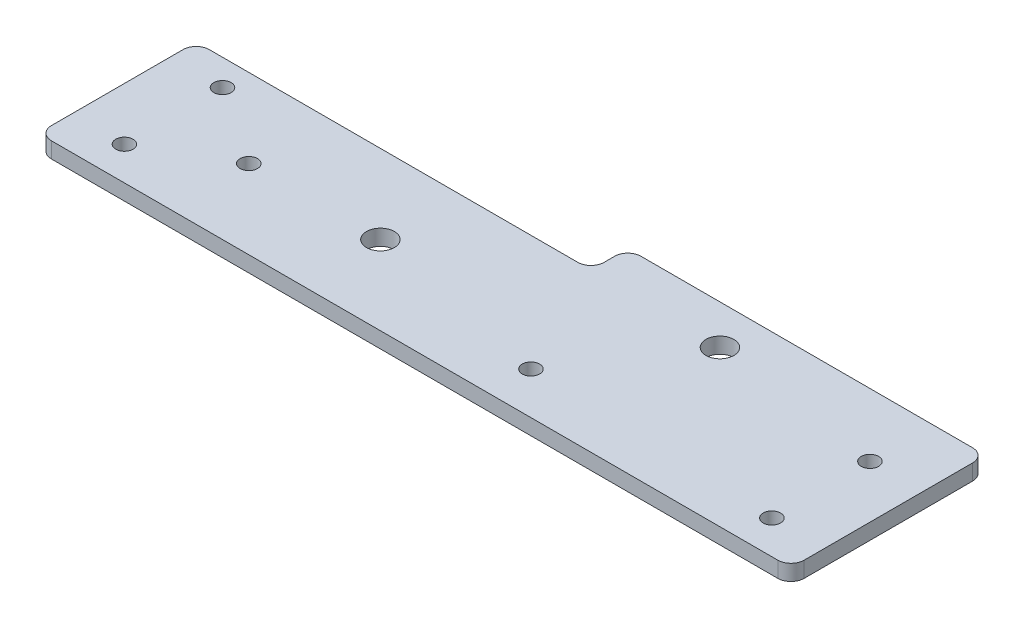
ISO-10303-21;
HEADER;
FILE_DESCRIPTION(('STEP AP214'),'2;1');
FILE_NAME('part.step','',(''),(''),'','','');
FILE_SCHEMA(('AUTOMOTIVE_DESIGN { 1 0 10303 214 1 1 1 1 }'));
ENDSEC;
DATA;
#1=APPLICATION_CONTEXT('core data for automotive mechanical design processes');
#2=APPLICATION_PROTOCOL_DEFINITION('international standard','automotive_design',2000,#1);
#3=PRODUCT_CONTEXT('',#1,'mechanical');
#4=PRODUCT('Part','Part','',(#3));
#5=PRODUCT_RELATED_PRODUCT_CATEGORY('part','',(#4));
#6=PRODUCT_DEFINITION_FORMATION('','',#4);
#7=PRODUCT_DEFINITION_CONTEXT('part definition',#1,'design');
#8=PRODUCT_DEFINITION('design','',#6,#7);
#9=PRODUCT_DEFINITION_SHAPE('','',#8);
#10=(LENGTH_UNIT() NAMED_UNIT(*) SI_UNIT(.MILLI.,.METRE.));
#11=(NAMED_UNIT(*) PLANE_ANGLE_UNIT() SI_UNIT($,.RADIAN.));
#12=(NAMED_UNIT(*) SI_UNIT($,.STERADIAN.) SOLID_ANGLE_UNIT());
#13=UNCERTAINTY_MEASURE_WITH_UNIT(LENGTH_MEASURE(1.E-05),#10,'distance_accuracy_value','');
#14=(GEOMETRIC_REPRESENTATION_CONTEXT(3) GLOBAL_UNCERTAINTY_ASSIGNED_CONTEXT((#13)) GLOBAL_UNIT_ASSIGNED_CONTEXT((#10,
#11,#12)) REPRESENTATION_CONTEXT('',''));
#15=CARTESIAN_POINT('',(0.,0.,0.));
#16=DIRECTION('',(0.,0.,1.));
#17=DIRECTION('',(1.,0.,0.));
#18=AXIS2_PLACEMENT_3D('',#15,#16,#17);
#19=CARTESIAN_POINT('',(0.,3.,0.));
#20=DIRECTION('',(0.,1.,0.));
#21=DIRECTION('',(0.,0.,1.));
#22=AXIS2_PLACEMENT_3D('',#19,#20,#21);
#23=PLANE('',#22);
#24=CARTESIAN_POINT('',(100.,3.,-29.5));
#25=DIRECTION('',(0.,1.,0.));
#26=DIRECTION('',(0.,0.,1.));
#27=AXIS2_PLACEMENT_3D('',#24,#25,#26);
#28=CIRCLE('',#27,2.65);
#29=CARTESIAN_POINT('',(100.,3.,-26.85));
#30=VERTEX_POINT('',#29);
#31=EDGE_CURVE('E263',#30,#30,#28,.T.);
#32=ORIENTED_EDGE('',*,*,#31,.F.);
#33=EDGE_LOOP('',(#32));
#34=FACE_BOUND('',#33,.T.);
#35=CARTESIAN_POINT('',(50.,3.,-15.));
#36=DIRECTION('',(0.,1.,0.));
#37=DIRECTION('',(0.,0.,1.));
#38=AXIS2_PLACEMENT_3D('',#35,#36,#37);
#39=CIRCLE('',#38,2.65);
#40=CARTESIAN_POINT('',(50.,3.,-12.35));
#41=VERTEX_POINT('',#40);
#42=EDGE_CURVE('E251',#41,#41,#39,.T.);
#43=ORIENTED_EDGE('',*,*,#42,.F.);
#44=EDGE_LOOP('',(#43));
#45=FACE_BOUND('',#44,.T.);
#46=CARTESIAN_POINT('',(133.,3.,-25.));
#47=DIRECTION('',(0.,1.,0.));
#48=DIRECTION('',(0.,0.,1.));
#49=AXIS2_PLACEMENT_3D('',#46,#47,#48);
#50=CIRCLE('',#49,1.65000000000002);
#51=CARTESIAN_POINT('',(133.,3.,-23.35));
#52=VERTEX_POINT('',#51);
#53=EDGE_CURVE('E239',#52,#52,#50,.T.);
#54=ORIENTED_EDGE('',*,*,#53,.F.);
#55=EDGE_LOOP('',(#54));
#56=FACE_BOUND('',#55,.T.);
#57=CARTESIAN_POINT('',(9.99999999999999,3.,-25.));
#58=DIRECTION('',(0.,1.,0.));
#59=DIRECTION('',(0.,0.,1.));
#60=AXIS2_PLACEMENT_3D('',#57,#58,#59);
#61=CIRCLE('',#60,1.65);
#62=CARTESIAN_POINT('',(9.99999999999999,3.,-23.35));
#63=VERTEX_POINT('',#62);
#64=EDGE_CURVE('E156',#63,#63,#61,.T.);
#65=ORIENTED_EDGE('',*,*,#64,.F.);
#66=EDGE_LOOP('',(#65));
#67=FACE_BOUND('',#66,.T.);
#68=DIRECTION('',(0.,0.,1.));
#69=VECTOR('',#68,1.);
#70=CARTESIAN_POINT('',(0.,3.,-30.));
#71=LINE('',#70,#69);
#72=CARTESIAN_POINT('',(0.,3.,-27.5));
#73=VERTEX_POINT('',#72);
#74=CARTESIAN_POINT('',(0.,3.,-2.5));
#75=VERTEX_POINT('',#74);
#76=EDGE_CURVE('E167',#73,#75,#71,.T.);
#77=ORIENTED_EDGE('',*,*,#76,.T.);
#78=CARTESIAN_POINT('',(2.5,3.,-2.5));
#79=DIRECTION('',(0.,1.,0.));
#80=DIRECTION('',(0.,0.,1.));
#81=AXIS2_PLACEMENT_3D('',#78,#79,#80);
#82=CIRCLE('',#81,2.5);
#83=CARTESIAN_POINT('',(2.5,3.,0.));
#84=VERTEX_POINT('',#83);
#85=EDGE_CURVE('E187',#75,#84,#82,.T.);
#86=ORIENTED_EDGE('',*,*,#85,.T.);
#87=DIRECTION('',(1.,0.,0.));
#88=VECTOR('',#87,1.);
#89=CARTESIAN_POINT('',(0.,3.,0.));
#90=LINE('',#89,#88);
#91=CARTESIAN_POINT('',(140.5,3.,0.));
#92=VERTEX_POINT('',#91);
#93=EDGE_CURVE('E143',#84,#92,#90,.T.);
#94=ORIENTED_EDGE('',*,*,#93,.T.);
#95=CARTESIAN_POINT('',(140.5,3.,-2.5));
#96=DIRECTION('',(0.,1.,0.));
#97=DIRECTION('',(0.,0.,1.));
#98=AXIS2_PLACEMENT_3D('',#95,#96,#97);
#99=CIRCLE('',#98,2.5);
#100=CARTESIAN_POINT('',(143.,3.,-2.5));
#101=VERTEX_POINT('',#100);
#102=EDGE_CURVE('E185',#92,#101,#99,.T.);
#103=ORIENTED_EDGE('',*,*,#102,.T.);
#104=DIRECTION('',(0.,0.,-1.));
#105=VECTOR('',#104,1.);
#106=CARTESIAN_POINT('',(143.,3.,0.));
#107=LINE('',#106,#105);
#108=CARTESIAN_POINT('',(143.,3.,-34.5));
#109=VERTEX_POINT('',#108);
#110=EDGE_CURVE('E224',#101,#109,#107,.T.);
#111=ORIENTED_EDGE('',*,*,#110,.T.);
#112=CARTESIAN_POINT('',(140.5,3.,-34.5));
#113=DIRECTION('',(0.,1.,0.));
#114=DIRECTION('',(0.,0.,1.));
#115=AXIS2_PLACEMENT_3D('',#112,#113,#114);
#116=CIRCLE('',#115,2.5);
#117=CARTESIAN_POINT('',(140.5,3.,-37.));
#118=VERTEX_POINT('',#117);
#119=EDGE_CURVE('E183',#109,#118,#116,.T.);
#120=ORIENTED_EDGE('',*,*,#119,.T.);
#121=DIRECTION('',(-1.,0.,0.));
#122=VECTOR('',#121,1.);
#123=CARTESIAN_POINT('',(143.,3.,-37.));
#124=LINE('',#123,#122);
#125=CARTESIAN_POINT('',(77.5,3.,-37.));
#126=VERTEX_POINT('',#125);
#127=EDGE_CURVE('E219',#118,#126,#124,.T.);
#128=ORIENTED_EDGE('',*,*,#127,.T.);
#129=CARTESIAN_POINT('',(77.5,3.,-34.5));
#130=DIRECTION('',(0.,1.,0.));
#131=DIRECTION('',(0.,0.,1.));
#132=AXIS2_PLACEMENT_3D('',#129,#130,#131);
#133=CIRCLE('',#132,2.5);
#134=CARTESIAN_POINT('',(75.,3.,-34.5));
#135=VERTEX_POINT('',#134);
#136=EDGE_CURVE('E179',#126,#135,#133,.T.);
#137=ORIENTED_EDGE('',*,*,#136,.T.);
#138=DIRECTION('',(0.,0.,1.));
#139=VECTOR('',#138,1.);
#140=CARTESIAN_POINT('',(75.,3.,-37.));
#141=LINE('',#140,#139);
#142=CARTESIAN_POINT('',(75.,3.,-32.5));
#143=VERTEX_POINT('',#142);
#144=EDGE_CURVE('E218',#135,#143,#141,.T.);
#145=ORIENTED_EDGE('',*,*,#144,.T.);
#146=CARTESIAN_POINT('',(72.5,3.,-32.5));
#147=DIRECTION('',(0.,1.,0.));
#148=DIRECTION('',(0.,0.,1.));
#149=AXIS2_PLACEMENT_3D('',#146,#147,#148);
#150=CIRCLE('',#149,2.5);
#151=CARTESIAN_POINT('',(72.5,3.,-30.));
#152=VERTEX_POINT('',#151);
#153=EDGE_CURVE('E11',#143,#152,#150,.F.);
#154=ORIENTED_EDGE('',*,*,#153,.T.);
#155=DIRECTION('',(-1.,0.,0.));
#156=VECTOR('',#155,1.);
#157=CARTESIAN_POINT('',(75.,3.,-30.));
#158=LINE('',#157,#156);
#159=CARTESIAN_POINT('',(2.5,3.,-30.));
#160=VERTEX_POINT('',#159);
#161=EDGE_CURVE('E168',#152,#160,#158,.T.);
#162=ORIENTED_EDGE('',*,*,#161,.T.);
#163=CARTESIAN_POINT('',(2.5,3.,-27.5));
#164=DIRECTION('',(0.,1.,0.));
#165=DIRECTION('',(0.,0.,1.));
#166=AXIS2_PLACEMENT_3D('',#163,#164,#165);
#167=CIRCLE('',#166,2.5);
#168=EDGE_CURVE('E181',#160,#73,#167,.T.);
#169=ORIENTED_EDGE('',*,*,#168,.T.);
#170=EDGE_LOOP('',(#77,#86,#94,#103,#111,#120,#128,#137,#145,#154,#162,#169));
#171=FACE_BOUND('',#170,.T.);
#172=CARTESIAN_POINT('',(10.,3.,-6.37));
#173=DIRECTION('',(0.,1.,0.));
#174=DIRECTION('',(0.,0.,1.));
#175=AXIS2_PLACEMENT_3D('',#172,#173,#174);
#176=CIRCLE('',#175,1.65);
#177=CARTESIAN_POINT('',(10.,3.,-4.72));
#178=VERTEX_POINT('',#177);
#179=EDGE_CURVE('E233',#178,#178,#176,.T.);
#180=ORIENTED_EDGE('',*,*,#179,.F.);
#181=EDGE_LOOP('',(#180));
#182=FACE_BOUND('',#181,.T.);
#183=CARTESIAN_POINT('',(133.,3.,-6.37000000000001));
#184=DIRECTION('',(0.,1.,0.));
#185=DIRECTION('',(0.,0.,1.));
#186=AXIS2_PLACEMENT_3D('',#183,#184,#185);
#187=CIRCLE('',#186,1.65000000000002);
#188=CARTESIAN_POINT('',(133.,3.,-4.71999999999999));
#189=VERTEX_POINT('',#188);
#190=EDGE_CURVE('E245',#189,#189,#187,.T.);
#191=ORIENTED_EDGE('',*,*,#190,.F.);
#192=EDGE_LOOP('',(#191));
#193=FACE_BOUND('',#192,.T.);
#194=CARTESIAN_POINT('',(25.,3.,-15.));
#195=DIRECTION('',(0.,1.,0.));
#196=DIRECTION('',(0.,0.,1.));
#197=AXIS2_PLACEMENT_3D('',#194,#195,#196);
#198=CIRCLE('',#197,1.65);
#199=CARTESIAN_POINT('',(25.,3.,-13.35));
#200=VERTEX_POINT('',#199);
#201=EDGE_CURVE('E257',#200,#200,#198,.T.);
#202=ORIENTED_EDGE('',*,*,#201,.F.);
#203=EDGE_LOOP('',(#202));
#204=FACE_BOUND('',#203,.T.);
#205=CARTESIAN_POINT('',(85.6,3.,-8.00000000000002));
#206=DIRECTION('',(0.,1.,0.));
#207=DIRECTION('',(0.,0.,1.));
#208=AXIS2_PLACEMENT_3D('',#205,#206,#207);
#209=CIRCLE('',#208,1.65);
#210=CARTESIAN_POINT('',(85.6,3.,-6.35000000000002));
#211=VERTEX_POINT('',#210);
#212=EDGE_CURVE('E269',#211,#211,#209,.T.);
#213=ORIENTED_EDGE('',*,*,#212,.F.);
#214=EDGE_LOOP('',(#213));
#215=FACE_BOUND('',#214,.T.);
#216=ADVANCED_FACE('F34',(#34,#45,#56,#67,#171,#182,#193,#204,#215),#23,.T.);
#217=CARTESIAN_POINT('',(0.,0.,0.));
#218=DIRECTION('',(0.,1.,0.));
#219=DIRECTION('',(0.,0.,1.));
#220=AXIS2_PLACEMENT_3D('',#217,#218,#219);
#221=PLANE('',#220);
#222=DIRECTION('',(1.,0.,0.));
#223=VECTOR('',#222,1.);
#224=CARTESIAN_POINT('',(0.,0.,0.));
#225=LINE('',#224,#223);
#226=CARTESIAN_POINT('',(2.5,0.,0.));
#227=VERTEX_POINT('',#226);
#228=CARTESIAN_POINT('',(140.5,0.,0.));
#229=VERTEX_POINT('',#228);
#230=EDGE_CURVE('E140',#227,#229,#225,.T.);
#231=ORIENTED_EDGE('',*,*,#230,.F.);
#232=CARTESIAN_POINT('',(2.5,0.,-2.5));
#233=DIRECTION('',(0.,1.,0.));
#234=DIRECTION('',(0.,0.,1.));
#235=AXIS2_PLACEMENT_3D('',#232,#233,#234);
#236=CIRCLE('',#235,2.5);
#237=CARTESIAN_POINT('',(0.,0.,-2.5));
#238=VERTEX_POINT('',#237);
#239=EDGE_CURVE('E123',#227,#238,#236,.F.);
#240=ORIENTED_EDGE('',*,*,#239,.T.);
#241=DIRECTION('',(0.,0.,1.));
#242=VECTOR('',#241,1.);
#243=CARTESIAN_POINT('',(0.,0.,-30.));
#244=LINE('',#243,#242);
#245=CARTESIAN_POINT('',(0.,0.,-27.5));
#246=VERTEX_POINT('',#245);
#247=EDGE_CURVE('E151',#246,#238,#244,.T.);
#248=ORIENTED_EDGE('',*,*,#247,.F.);
#249=CARTESIAN_POINT('',(2.5,0.,-27.5));
#250=DIRECTION('',(0.,1.,0.));
#251=DIRECTION('',(0.,0.,1.));
#252=AXIS2_PLACEMENT_3D('',#249,#250,#251);
#253=CIRCLE('',#252,2.5);
#254=CARTESIAN_POINT('',(2.5,0.,-30.));
#255=VERTEX_POINT('',#254);
#256=EDGE_CURVE('E171',#246,#255,#253,.F.);
#257=ORIENTED_EDGE('',*,*,#256,.T.);
#258=DIRECTION('',(-1.,0.,0.));
#259=VECTOR('',#258,1.);
#260=CARTESIAN_POINT('',(75.,0.,-30.));
#261=LINE('',#260,#259);
#262=CARTESIAN_POINT('',(72.5,0.,-30.));
#263=VERTEX_POINT('',#262);
#264=EDGE_CURVE('E165',#263,#255,#261,.T.);
#265=ORIENTED_EDGE('',*,*,#264,.F.);
#266=CARTESIAN_POINT('',(72.5,0.,-32.5));
#267=DIRECTION('',(0.,1.,0.));
#268=DIRECTION('',(0.,0.,1.));
#269=AXIS2_PLACEMENT_3D('',#266,#267,#268);
#270=CIRCLE('',#269,2.5);
#271=CARTESIAN_POINT('',(75.,0.,-32.5));
#272=VERTEX_POINT('',#271);
#273=EDGE_CURVE('E42',#263,#272,#270,.T.);
#274=ORIENTED_EDGE('',*,*,#273,.T.);
#275=DIRECTION('',(0.,0.,1.));
#276=VECTOR('',#275,1.);
#277=CARTESIAN_POINT('',(75.,0.,-37.));
#278=LINE('',#277,#276);
#279=CARTESIAN_POINT('',(75.,0.,-34.5));
#280=VERTEX_POINT('',#279);
#281=EDGE_CURVE('E162',#280,#272,#278,.T.);
#282=ORIENTED_EDGE('',*,*,#281,.F.);
#283=CARTESIAN_POINT('',(77.5,0.,-34.5));
#284=DIRECTION('',(0.,1.,0.));
#285=DIRECTION('',(0.,0.,1.));
#286=AXIS2_PLACEMENT_3D('',#283,#284,#285);
#287=CIRCLE('',#286,2.5);
#288=CARTESIAN_POINT('',(77.5,0.,-37.));
#289=VERTEX_POINT('',#288);
#290=EDGE_CURVE('E144',#280,#289,#287,.F.);
#291=ORIENTED_EDGE('',*,*,#290,.T.);
#292=DIRECTION('',(-1.,0.,0.));
#293=VECTOR('',#292,1.);
#294=CARTESIAN_POINT('',(143.,0.,-37.));
#295=LINE('',#294,#293);
#296=CARTESIAN_POINT('',(140.5,0.,-37.));
#297=VERTEX_POINT('',#296);
#298=EDGE_CURVE('E154',#297,#289,#295,.T.);
#299=ORIENTED_EDGE('',*,*,#298,.F.);
#300=CARTESIAN_POINT('',(140.5,0.,-34.5));
#301=DIRECTION('',(0.,1.,0.));
#302=DIRECTION('',(0.,0.,1.));
#303=AXIS2_PLACEMENT_3D('',#300,#301,#302);
#304=CIRCLE('',#303,2.5);
#305=CARTESIAN_POINT('',(143.,0.,-34.5));
#306=VERTEX_POINT('',#305);
#307=EDGE_CURVE('E173',#297,#306,#304,.F.);
#308=ORIENTED_EDGE('',*,*,#307,.T.);
#309=DIRECTION('',(0.,0.,-1.));
#310=VECTOR('',#309,1.);
#311=CARTESIAN_POINT('',(143.,0.,0.));
#312=LINE('',#311,#310);
#313=CARTESIAN_POINT('',(143.,0.,-2.5));
#314=VERTEX_POINT('',#313);
#315=EDGE_CURVE('E150',#314,#306,#312,.T.);
#316=ORIENTED_EDGE('',*,*,#315,.F.);
#317=CARTESIAN_POINT('',(140.5,0.,-2.5));
#318=DIRECTION('',(0.,1.,0.));
#319=DIRECTION('',(0.,0.,1.));
#320=AXIS2_PLACEMENT_3D('',#317,#318,#319);
#321=CIRCLE('',#320,2.5);
#322=EDGE_CURVE('E134',#314,#229,#321,.F.);
#323=ORIENTED_EDGE('',*,*,#322,.T.);
#324=EDGE_LOOP('',(#231,#240,#248,#257,#265,#274,#282,#291,#299,#308,#316,#323));
#325=FACE_BOUND('',#324,.T.);
#326=CARTESIAN_POINT('',(9.99999999999999,0.,-25.));
#327=DIRECTION('',(0.,1.,0.));
#328=DIRECTION('',(0.,0.,1.));
#329=AXIS2_PLACEMENT_3D('',#326,#327,#328);
#330=CIRCLE('',#329,1.65);
#331=CARTESIAN_POINT('',(9.99999999999999,0.,-23.35));
#332=VERTEX_POINT('',#331);
#333=EDGE_CURVE('E230',#332,#332,#330,.T.);
#334=ORIENTED_EDGE('',*,*,#333,.T.);
#335=EDGE_LOOP('',(#334));
#336=FACE_BOUND('',#335,.T.);
#337=CARTESIAN_POINT('',(10.,0.,-6.37));
#338=DIRECTION('',(0.,1.,0.));
#339=DIRECTION('',(0.,0.,1.));
#340=AXIS2_PLACEMENT_3D('',#337,#338,#339);
#341=CIRCLE('',#340,1.65);
#342=CARTESIAN_POINT('',(10.,0.,-4.72));
#343=VERTEX_POINT('',#342);
#344=EDGE_CURVE('E236',#343,#343,#341,.T.);
#345=ORIENTED_EDGE('',*,*,#344,.T.);
#346=EDGE_LOOP('',(#345));
#347=FACE_BOUND('',#346,.T.);
#348=CARTESIAN_POINT('',(133.,0.,-25.));
#349=DIRECTION('',(0.,1.,0.));
#350=DIRECTION('',(0.,0.,1.));
#351=AXIS2_PLACEMENT_3D('',#348,#349,#350);
#352=CIRCLE('',#351,1.65000000000002);
#353=CARTESIAN_POINT('',(133.,0.,-23.35));
#354=VERTEX_POINT('',#353);
#355=EDGE_CURVE('E242',#354,#354,#352,.T.);
#356=ORIENTED_EDGE('',*,*,#355,.T.);
#357=EDGE_LOOP('',(#356));
#358=FACE_BOUND('',#357,.T.);
#359=CARTESIAN_POINT('',(133.,0.,-6.37000000000001));
#360=DIRECTION('',(0.,1.,0.));
#361=DIRECTION('',(0.,0.,1.));
#362=AXIS2_PLACEMENT_3D('',#359,#360,#361);
#363=CIRCLE('',#362,1.65000000000002);
#364=CARTESIAN_POINT('',(133.,0.,-4.71999999999999));
#365=VERTEX_POINT('',#364);
#366=EDGE_CURVE('E248',#365,#365,#363,.T.);
#367=ORIENTED_EDGE('',*,*,#366,.T.);
#368=EDGE_LOOP('',(#367));
#369=FACE_BOUND('',#368,.T.);
#370=CARTESIAN_POINT('',(50.,0.,-15.));
#371=DIRECTION('',(0.,1.,0.));
#372=DIRECTION('',(0.,0.,1.));
#373=AXIS2_PLACEMENT_3D('',#370,#371,#372);
#374=CIRCLE('',#373,2.65);
#375=CARTESIAN_POINT('',(50.,0.,-12.35));
#376=VERTEX_POINT('',#375);
#377=EDGE_CURVE('E254',#376,#376,#374,.T.);
#378=ORIENTED_EDGE('',*,*,#377,.T.);
#379=EDGE_LOOP('',(#378));
#380=FACE_BOUND('',#379,.T.);
#381=CARTESIAN_POINT('',(25.,0.,-15.));
#382=DIRECTION('',(0.,1.,0.));
#383=DIRECTION('',(0.,0.,1.));
#384=AXIS2_PLACEMENT_3D('',#381,#382,#383);
#385=CIRCLE('',#384,1.65);
#386=CARTESIAN_POINT('',(25.,0.,-13.35));
#387=VERTEX_POINT('',#386);
#388=EDGE_CURVE('E260',#387,#387,#385,.T.);
#389=ORIENTED_EDGE('',*,*,#388,.T.);
#390=EDGE_LOOP('',(#389));
#391=FACE_BOUND('',#390,.T.);
#392=CARTESIAN_POINT('',(100.,0.,-29.5));
#393=DIRECTION('',(0.,1.,0.));
#394=DIRECTION('',(0.,0.,1.));
#395=AXIS2_PLACEMENT_3D('',#392,#393,#394);
#396=CIRCLE('',#395,2.65);
#397=CARTESIAN_POINT('',(100.,0.,-26.85));
#398=VERTEX_POINT('',#397);
#399=EDGE_CURVE('E266',#398,#398,#396,.T.);
#400=ORIENTED_EDGE('',*,*,#399,.T.);
#401=EDGE_LOOP('',(#400));
#402=FACE_BOUND('',#401,.T.);
#403=CARTESIAN_POINT('',(85.6,0.,-8.00000000000002));
#404=DIRECTION('',(0.,1.,0.));
#405=DIRECTION('',(0.,0.,1.));
#406=AXIS2_PLACEMENT_3D('',#403,#404,#405);
#407=CIRCLE('',#406,1.65);
#408=CARTESIAN_POINT('',(85.6,0.,-6.35000000000002));
#409=VERTEX_POINT('',#408);
#410=EDGE_CURVE('E272',#409,#409,#407,.T.);
#411=ORIENTED_EDGE('',*,*,#410,.T.);
#412=EDGE_LOOP('',(#411));
#413=FACE_BOUND('',#412,.T.);
#414=ADVANCED_FACE('F147',(#325,#336,#347,#358,#369,#380,#391,#402,#413),#221,.F.);
#415=CARTESIAN_POINT('',(0.,3.,-30.));
#416=DIRECTION('',(1.,0.,0.));
#417=DIRECTION('',(0.,0.,-1.));
#418=AXIS2_PLACEMENT_3D('',#415,#416,#417);
#419=PLANE('',#418);
#420=ORIENTED_EDGE('',*,*,#247,.T.);
#421=DIRECTION('',(0.,-1.,0.));
#422=VECTOR('',#421,1.);
#423=CARTESIAN_POINT('',(0.,3.,-2.5));
#424=LINE('',#423,#422);
#425=EDGE_CURVE('E128',#238,#75,#424,.F.);
#426=ORIENTED_EDGE('',*,*,#425,.T.);
#427=ORIENTED_EDGE('',*,*,#76,.F.);
#428=DIRECTION('',(0.,-1.,0.));
#429=VECTOR('',#428,1.);
#430=CARTESIAN_POINT('',(0.,3.,-27.5));
#431=LINE('',#430,#429);
#432=EDGE_CURVE('E133',#73,#246,#431,.T.);
#433=ORIENTED_EDGE('',*,*,#432,.T.);
#434=EDGE_LOOP('',(#420,#426,#427,#433));
#435=FACE_BOUND('',#434,.T.);
#436=ADVANCED_FACE('F287',(#435),#419,.F.);
#437=CARTESIAN_POINT('',(0.,3.,0.));
#438=DIRECTION('',(0.,0.,-1.));
#439=DIRECTION('',(-1.,0.,0.));
#440=AXIS2_PLACEMENT_3D('',#437,#438,#439);
#441=PLANE('',#440);
#442=ORIENTED_EDGE('',*,*,#93,.F.);
#443=DIRECTION('',(0.,-1.,0.));
#444=VECTOR('',#443,1.);
#445=CARTESIAN_POINT('',(2.5,3.,0.));
#446=LINE('',#445,#444);
#447=EDGE_CURVE('E127',#84,#227,#446,.T.);
#448=ORIENTED_EDGE('',*,*,#447,.T.);
#449=ORIENTED_EDGE('',*,*,#230,.T.);
#450=DIRECTION('',(0.,-1.,0.));
#451=VECTOR('',#450,1.);
#452=CARTESIAN_POINT('',(140.5,3.,0.));
#453=LINE('',#452,#451);
#454=EDGE_CURVE('E145',#229,#92,#453,.F.);
#455=ORIENTED_EDGE('',*,*,#454,.T.);
#456=EDGE_LOOP('',(#442,#448,#449,#455));
#457=FACE_BOUND('',#456,.T.);
#458=ADVANCED_FACE('F139',(#457),#441,.F.);
#459=CARTESIAN_POINT('',(143.,3.,0.));
#460=DIRECTION('',(-1.,0.,0.));
#461=DIRECTION('',(0.,0.,1.));
#462=AXIS2_PLACEMENT_3D('',#459,#460,#461);
#463=PLANE('',#462);
#464=ORIENTED_EDGE('',*,*,#110,.F.);
#465=DIRECTION('',(0.,-1.,0.));
#466=VECTOR('',#465,1.);
#467=CARTESIAN_POINT('',(143.,3.,-2.5));
#468=LINE('',#467,#466);
#469=EDGE_CURVE('E191',#101,#314,#468,.T.);
#470=ORIENTED_EDGE('',*,*,#469,.T.);
#471=ORIENTED_EDGE('',*,*,#315,.T.);
#472=DIRECTION('',(0.,-1.,0.));
#473=VECTOR('',#472,1.);
#474=CARTESIAN_POINT('',(143.,3.,-34.5));
#475=LINE('',#474,#473);
#476=EDGE_CURVE('E189',#306,#109,#475,.F.);
#477=ORIENTED_EDGE('',*,*,#476,.T.);
#478=EDGE_LOOP('',(#464,#470,#471,#477));
#479=FACE_BOUND('',#478,.T.);
#480=ADVANCED_FACE('F302',(#479),#463,.F.);
#481=CARTESIAN_POINT('',(143.,3.,-37.));
#482=DIRECTION('',(0.,0.,1.));
#483=DIRECTION('',(1.,0.,0.));
#484=AXIS2_PLACEMENT_3D('',#481,#482,#483);
#485=PLANE('',#484);
#486=ORIENTED_EDGE('',*,*,#127,.F.);
#487=DIRECTION('',(0.,-1.,0.));
#488=VECTOR('',#487,1.);
#489=CARTESIAN_POINT('',(140.5,3.,-37.));
#490=LINE('',#489,#488);
#491=EDGE_CURVE('E196',#118,#297,#490,.T.);
#492=ORIENTED_EDGE('',*,*,#491,.T.);
#493=ORIENTED_EDGE('',*,*,#298,.T.);
#494=DIRECTION('',(0.,-1.,0.));
#495=VECTOR('',#494,1.);
#496=CARTESIAN_POINT('',(77.5,3.,-37.));
#497=LINE('',#496,#495);
#498=EDGE_CURVE('E194',#289,#126,#497,.F.);
#499=ORIENTED_EDGE('',*,*,#498,.T.);
#500=EDGE_LOOP('',(#486,#492,#493,#499));
#501=FACE_BOUND('',#500,.T.);
#502=ADVANCED_FACE('F299',(#501),#485,.F.);
#503=CARTESIAN_POINT('',(75.,3.,-37.));
#504=DIRECTION('',(1.,0.,0.));
#505=DIRECTION('',(0.,0.,-1.));
#506=AXIS2_PLACEMENT_3D('',#503,#504,#505);
#507=PLANE('',#506);
#508=ORIENTED_EDGE('',*,*,#144,.F.);
#509=DIRECTION('',(0.,-1.,0.));
#510=VECTOR('',#509,1.);
#511=CARTESIAN_POINT('',(75.,3.,-34.5));
#512=LINE('',#511,#510);
#513=EDGE_CURVE('E205',#135,#280,#512,.T.);
#514=ORIENTED_EDGE('',*,*,#513,.T.);
#515=ORIENTED_EDGE('',*,*,#281,.T.);
#516=DIRECTION('',(0.,-1.,0.));
#517=VECTOR('',#516,1.);
#518=CARTESIAN_POINT('',(75.,3.,-32.5));
#519=LINE('',#518,#517);
#520=EDGE_CURVE('E203',#272,#143,#519,.F.);
#521=ORIENTED_EDGE('',*,*,#520,.T.);
#522=EDGE_LOOP('',(#508,#514,#515,#521));
#523=FACE_BOUND('',#522,.T.);
#524=ADVANCED_FACE('F214',(#523),#507,.F.);
#525=CARTESIAN_POINT('',(75.,3.,-30.));
#526=DIRECTION('',(0.,0.,1.));
#527=DIRECTION('',(1.,0.,0.));
#528=AXIS2_PLACEMENT_3D('',#525,#526,#527);
#529=PLANE('',#528);
#530=ORIENTED_EDGE('',*,*,#264,.T.);
#531=DIRECTION('',(0.,-1.,0.));
#532=VECTOR('',#531,1.);
#533=CARTESIAN_POINT('',(2.5,3.,-30.));
#534=LINE('',#533,#532);
#535=EDGE_CURVE('E49',#255,#160,#534,.F.);
#536=ORIENTED_EDGE('',*,*,#535,.T.);
#537=ORIENTED_EDGE('',*,*,#161,.F.);
#538=DIRECTION('',(0.,-1.,0.));
#539=VECTOR('',#538,1.);
#540=CARTESIAN_POINT('',(72.5,0.,-30.));
#541=LINE('',#540,#539);
#542=EDGE_CURVE('E199',#152,#263,#541,.T.);
#543=ORIENTED_EDGE('',*,*,#542,.T.);
#544=EDGE_LOOP('',(#530,#536,#537,#543));
#545=FACE_BOUND('',#544,.T.);
#546=ADVANCED_FACE('F216',(#545),#529,.F.);
#547=CARTESIAN_POINT('',(9.99999999999999,3.,-25.));
#548=DIRECTION('',(0.,-1.,0.));
#549=DIRECTION('',(0.,0.,-1.));
#550=AXIS2_PLACEMENT_3D('',#547,#548,#549);
#551=CYLINDRICAL_SURFACE('',#550,1.65);
#552=ORIENTED_EDGE('',*,*,#64,.T.);
#553=EDGE_LOOP('',(#552));
#554=FACE_BOUND('',#553,.T.);
#555=ORIENTED_EDGE('',*,*,#333,.F.);
#556=EDGE_LOOP('',(#555));
#557=FACE_BOUND('',#556,.T.);
#558=ADVANCED_FACE('F292',(#554,#557),#551,.F.);
#559=CARTESIAN_POINT('',(10.,3.,-6.37));
#560=DIRECTION('',(0.,-1.,0.));
#561=DIRECTION('',(0.,0.,-1.));
#562=AXIS2_PLACEMENT_3D('',#559,#560,#561);
#563=CYLINDRICAL_SURFACE('',#562,1.65);
#564=ORIENTED_EDGE('',*,*,#179,.T.);
#565=EDGE_LOOP('',(#564));
#566=FACE_BOUND('',#565,.T.);
#567=ORIENTED_EDGE('',*,*,#344,.F.);
#568=EDGE_LOOP('',(#567));
#569=FACE_BOUND('',#568,.T.);
#570=ADVANCED_FACE('F379',(#566,#569),#563,.F.);
#571=CARTESIAN_POINT('',(133.,3.,-25.));
#572=DIRECTION('',(0.,-1.,0.));
#573=DIRECTION('',(0.,0.,-1.));
#574=AXIS2_PLACEMENT_3D('',#571,#572,#573);
#575=CYLINDRICAL_SURFACE('',#574,1.65000000000002);
#576=ORIENTED_EDGE('',*,*,#53,.T.);
#577=EDGE_LOOP('',(#576));
#578=FACE_BOUND('',#577,.T.);
#579=ORIENTED_EDGE('',*,*,#355,.F.);
#580=EDGE_LOOP('',(#579));
#581=FACE_BOUND('',#580,.T.);
#582=ADVANCED_FACE('F376',(#578,#581),#575,.F.);
#583=CARTESIAN_POINT('',(133.,3.,-6.37000000000001));
#584=DIRECTION('',(0.,-1.,0.));
#585=DIRECTION('',(0.,0.,-1.));
#586=AXIS2_PLACEMENT_3D('',#583,#584,#585);
#587=CYLINDRICAL_SURFACE('',#586,1.65000000000002);
#588=ORIENTED_EDGE('',*,*,#190,.T.);
#589=EDGE_LOOP('',(#588));
#590=FACE_BOUND('',#589,.T.);
#591=ORIENTED_EDGE('',*,*,#366,.F.);
#592=EDGE_LOOP('',(#591));
#593=FACE_BOUND('',#592,.T.);
#594=ADVANCED_FACE('F372',(#590,#593),#587,.F.);
#595=CARTESIAN_POINT('',(50.,3.,-15.));
#596=DIRECTION('',(0.,-1.,0.));
#597=DIRECTION('',(0.,0.,-1.));
#598=AXIS2_PLACEMENT_3D('',#595,#596,#597);
#599=CYLINDRICAL_SURFACE('',#598,2.65);
#600=ORIENTED_EDGE('',*,*,#42,.T.);
#601=EDGE_LOOP('',(#600));
#602=FACE_BOUND('',#601,.T.);
#603=ORIENTED_EDGE('',*,*,#377,.F.);
#604=EDGE_LOOP('',(#603));
#605=FACE_BOUND('',#604,.T.);
#606=ADVANCED_FACE('F354',(#602,#605),#599,.F.);
#607=CARTESIAN_POINT('',(25.,3.,-15.));
#608=DIRECTION('',(0.,-1.,0.));
#609=DIRECTION('',(0.,0.,-1.));
#610=AXIS2_PLACEMENT_3D('',#607,#608,#609);
#611=CYLINDRICAL_SURFACE('',#610,1.65);
#612=ORIENTED_EDGE('',*,*,#201,.T.);
#613=EDGE_LOOP('',(#612));
#614=FACE_BOUND('',#613,.T.);
#615=ORIENTED_EDGE('',*,*,#388,.F.);
#616=EDGE_LOOP('',(#615));
#617=FACE_BOUND('',#616,.T.);
#618=ADVANCED_FACE('F350',(#614,#617),#611,.F.);
#619=CARTESIAN_POINT('',(100.,3.,-29.5));
#620=DIRECTION('',(0.,-1.,0.));
#621=DIRECTION('',(0.,0.,-1.));
#622=AXIS2_PLACEMENT_3D('',#619,#620,#621);
#623=CYLINDRICAL_SURFACE('',#622,2.65);
#624=ORIENTED_EDGE('',*,*,#31,.T.);
#625=EDGE_LOOP('',(#624));
#626=FACE_BOUND('',#625,.T.);
#627=ORIENTED_EDGE('',*,*,#399,.F.);
#628=EDGE_LOOP('',(#627));
#629=FACE_BOUND('',#628,.T.);
#630=ADVANCED_FACE('F353',(#626,#629),#623,.F.);
#631=CARTESIAN_POINT('',(85.6,3.,-8.00000000000002));
#632=DIRECTION('',(0.,-1.,0.));
#633=DIRECTION('',(0.,0.,-1.));
#634=AXIS2_PLACEMENT_3D('',#631,#632,#633);
#635=CYLINDRICAL_SURFACE('',#634,1.65);
#636=ORIENTED_EDGE('',*,*,#212,.T.);
#637=EDGE_LOOP('',(#636));
#638=FACE_BOUND('',#637,.T.);
#639=ORIENTED_EDGE('',*,*,#410,.F.);
#640=EDGE_LOOP('',(#639));
#641=FACE_BOUND('',#640,.T.);
#642=ADVANCED_FACE('F278',(#638,#641),#635,.F.);
#643=CARTESIAN_POINT('',(2.5,3.,-2.5));
#644=DIRECTION('',(0.,-1.,0.));
#645=DIRECTION('',(0.,0.,-1.));
#646=AXIS2_PLACEMENT_3D('',#643,#644,#645);
#647=CYLINDRICAL_SURFACE('',#646,2.5);
#648=ORIENTED_EDGE('',*,*,#85,.F.);
#649=ORIENTED_EDGE('',*,*,#425,.F.);
#650=ORIENTED_EDGE('',*,*,#239,.F.);
#651=ORIENTED_EDGE('',*,*,#447,.F.);
#652=EDGE_LOOP('',(#648,#649,#650,#651));
#653=FACE_BOUND('',#652,.T.);
#654=ADVANCED_FACE('F126',(#653),#647,.T.);
#655=CARTESIAN_POINT('',(140.5,3.,-2.5));
#656=DIRECTION('',(0.,-1.,0.));
#657=DIRECTION('',(0.,0.,-1.));
#658=AXIS2_PLACEMENT_3D('',#655,#656,#657);
#659=CYLINDRICAL_SURFACE('',#658,2.5);
#660=ORIENTED_EDGE('',*,*,#102,.F.);
#661=ORIENTED_EDGE('',*,*,#454,.F.);
#662=ORIENTED_EDGE('',*,*,#322,.F.);
#663=ORIENTED_EDGE('',*,*,#469,.F.);
#664=EDGE_LOOP('',(#660,#661,#662,#663));
#665=FACE_BOUND('',#664,.T.);
#666=ADVANCED_FACE('F314',(#665),#659,.T.);
#667=CARTESIAN_POINT('',(140.5,3.,-34.5));
#668=DIRECTION('',(0.,-1.,0.));
#669=DIRECTION('',(0.,0.,-1.));
#670=AXIS2_PLACEMENT_3D('',#667,#668,#669);
#671=CYLINDRICAL_SURFACE('',#670,2.5);
#672=ORIENTED_EDGE('',*,*,#119,.F.);
#673=ORIENTED_EDGE('',*,*,#476,.F.);
#674=ORIENTED_EDGE('',*,*,#307,.F.);
#675=ORIENTED_EDGE('',*,*,#491,.F.);
#676=EDGE_LOOP('',(#672,#673,#674,#675));
#677=FACE_BOUND('',#676,.T.);
#678=ADVANCED_FACE('F317',(#677),#671,.T.);
#679=CARTESIAN_POINT('',(2.5,3.,-27.5));
#680=DIRECTION('',(0.,-1.,0.));
#681=DIRECTION('',(0.,0.,-1.));
#682=AXIS2_PLACEMENT_3D('',#679,#680,#681);
#683=CYLINDRICAL_SURFACE('',#682,2.5);
#684=ORIENTED_EDGE('',*,*,#168,.F.);
#685=ORIENTED_EDGE('',*,*,#535,.F.);
#686=ORIENTED_EDGE('',*,*,#256,.F.);
#687=ORIENTED_EDGE('',*,*,#432,.F.);
#688=EDGE_LOOP('',(#684,#685,#686,#687));
#689=FACE_BOUND('',#688,.T.);
#690=ADVANCED_FACE('F321',(#689),#683,.T.);
#691=CARTESIAN_POINT('',(77.5,3.,-34.5));
#692=DIRECTION('',(0.,-1.,0.));
#693=DIRECTION('',(0.,0.,-1.));
#694=AXIS2_PLACEMENT_3D('',#691,#692,#693);
#695=CYLINDRICAL_SURFACE('',#694,2.5);
#696=ORIENTED_EDGE('',*,*,#136,.F.);
#697=ORIENTED_EDGE('',*,*,#498,.F.);
#698=ORIENTED_EDGE('',*,*,#290,.F.);
#699=ORIENTED_EDGE('',*,*,#513,.F.);
#700=EDGE_LOOP('',(#696,#697,#698,#699));
#701=FACE_BOUND('',#700,.T.);
#702=ADVANCED_FACE('F324',(#701),#695,.T.);
#703=CARTESIAN_POINT('',(72.5,3.,-32.5));
#704=DIRECTION('',(0.,1.,0.));
#705=DIRECTION('',(0.,0.,1.));
#706=AXIS2_PLACEMENT_3D('',#703,#704,#705);
#707=CYLINDRICAL_SURFACE('',#706,2.5);
#708=ORIENTED_EDGE('',*,*,#153,.F.);
#709=ORIENTED_EDGE('',*,*,#520,.F.);
#710=ORIENTED_EDGE('',*,*,#273,.F.);
#711=ORIENTED_EDGE('',*,*,#542,.F.);
#712=EDGE_LOOP('',(#708,#709,#710,#711));
#713=FACE_BOUND('',#712,.T.);
#714=ADVANCED_FACE('F36',(#713),#707,.F.);
#715=CLOSED_SHELL('',(#216,#414,#436,#458,#480,#502,#524,#546,#558,#570,#582,#594,#606,#618,
#630,#642,#654,#666,#678,#690,#702,#714));
#716=MANIFOLD_SOLID_BREP('B2',#715);
#717=ADVANCED_BREP_SHAPE_REPRESENTATION('',(#18,#716),#14);
#718=SHAPE_DEFINITION_REPRESENTATION(#9,#717);
ENDSEC;
END-ISO-10303-21;
